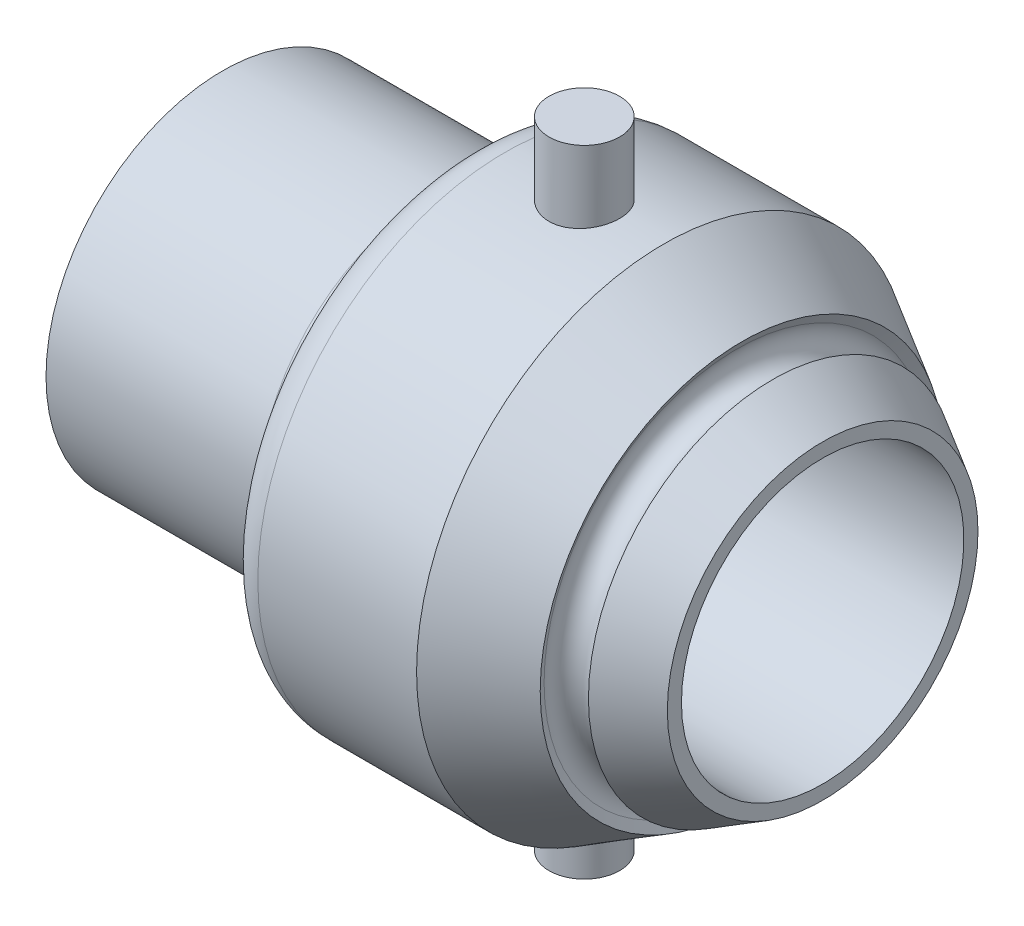
ISO-10303-21;
HEADER;
FILE_DESCRIPTION(('STEP AP214'),'2;1');
FILE_NAME('part.step','',(''),(''),'','','');
FILE_SCHEMA(('AUTOMOTIVE_DESIGN { 1 0 10303 214 1 1 1 1 }'));
ENDSEC;
DATA;
#1=APPLICATION_CONTEXT('core data for automotive mechanical design processes');
#2=APPLICATION_PROTOCOL_DEFINITION('international standard','automotive_design',2000,#1);
#3=PRODUCT_CONTEXT('',#1,'mechanical');
#4=PRODUCT('Part','Part','',(#3));
#5=PRODUCT_RELATED_PRODUCT_CATEGORY('part','',(#4));
#6=PRODUCT_DEFINITION_FORMATION('','',#4);
#7=PRODUCT_DEFINITION_CONTEXT('part definition',#1,'design');
#8=PRODUCT_DEFINITION('design','',#6,#7);
#9=PRODUCT_DEFINITION_SHAPE('','',#8);
#10=(LENGTH_UNIT() NAMED_UNIT(*) SI_UNIT(.MILLI.,.METRE.));
#11=(NAMED_UNIT(*) PLANE_ANGLE_UNIT() SI_UNIT($,.RADIAN.));
#12=(NAMED_UNIT(*) SI_UNIT($,.STERADIAN.) SOLID_ANGLE_UNIT());
#13=UNCERTAINTY_MEASURE_WITH_UNIT(LENGTH_MEASURE(1.E-05),#10,'distance_accuracy_value','');
#14=(GEOMETRIC_REPRESENTATION_CONTEXT(3) GLOBAL_UNCERTAINTY_ASSIGNED_CONTEXT((#13)) GLOBAL_UNIT_ASSIGNED_CONTEXT((#10,
#11,#12)) REPRESENTATION_CONTEXT('',''));
#15=CARTESIAN_POINT('',(0.,0.,0.));
#16=DIRECTION('',(0.,0.,1.));
#17=DIRECTION('',(1.,0.,0.));
#18=AXIS2_PLACEMENT_3D('',#15,#16,#17);
#19=CARTESIAN_POINT('',(-10.8230914252263,0.,0.));
#20=DIRECTION('',(-1.,0.,0.));
#21=DIRECTION('',(0.,0.,1.));
#22=AXIS2_PLACEMENT_3D('',#19,#20,#21);
#23=CYLINDRICAL_SURFACE('',#22,35.);
#24=CARTESIAN_POINT('',(-22.0596940616715,-34.6410161513775,-5.));
#25=CARTESIAN_POINT('',(-22.1993978457369,-34.6410154391642,-5.00000181224709));
#26=CARTESIAN_POINT('',(-22.339075896066,-34.6418629518526,-4.99414286579145));
#27=CARTESIAN_POINT('',(-22.617474900929,-34.6452270530683,-4.97075345355146));
#28=CARTESIAN_POINT('',(-22.7561956426971,-34.6477440012829,-4.95322047254227));
#29=CARTESIAN_POINT('',(-23.0317378663237,-34.6543774935575,-4.90659475442792));
#30=CARTESIAN_POINT('',(-23.1685579472749,-34.658495158733,-4.87749391506493));
#31=CARTESIAN_POINT('',(-23.439281311232,-34.6682124585494,-4.80793901020266));
#32=CARTESIAN_POINT('',(-23.5731835052484,-34.6738126365657,-4.76748078162647));
#33=CARTESIAN_POINT('',(-23.8369260548415,-34.6863261144397,-4.67556705521207));
#34=CARTESIAN_POINT('',(-23.9667707815617,-34.693237940152,-4.62412389515699));
#35=CARTESIAN_POINT('',(-24.2216972689336,-34.7081843179821,-4.51056759110166));
#36=CARTESIAN_POINT('',(-24.3467772539681,-34.7162192835375,-4.448450516));
#37=CARTESIAN_POINT('',(-24.591194657428,-34.733177760152,-4.31404058429293));
#38=CARTESIAN_POINT('',(-24.7105350631721,-34.7421008013996,-4.24175309977212));
#39=CARTESIAN_POINT('',(-24.942768913847,-34.7605914102924,-4.08745906749015));
#40=CARTESIAN_POINT('',(-25.055659944645,-34.7701592164031,-4.00544891520445));
#41=CARTESIAN_POINT('',(-25.2748472600182,-34.7897286484028,-3.83177001037932));
#42=CARTESIAN_POINT('',(-25.3810988300951,-34.7997325759272,-3.74004508176632));
#43=CARTESIAN_POINT('',(-25.5855502906051,-34.8198407002969,-3.54795991527328));
#44=CARTESIAN_POINT('',(-25.6837471872814,-34.8299449328735,-3.44759649479162));
#45=CARTESIAN_POINT('',(-25.8713346635188,-34.8499627971442,-3.23899148365546));
#46=CARTESIAN_POINT('',(-25.9607279976345,-34.8598764876709,-3.13075237578169));
#47=CARTESIAN_POINT('',(-26.1301493104485,-34.8792419453894,-2.90707506299795));
#48=CARTESIAN_POINT('',(-26.2101738232177,-34.8886935408841,-2.79163421791335));
#49=CARTESIAN_POINT('',(-26.3605522739934,-34.9069016885813,-2.55391409389059));
#50=CARTESIAN_POINT('',(-26.4308663522203,-34.9156553170766,-2.43160936732319));
#51=CARTESIAN_POINT('',(-26.5609590565678,-34.9321803214305,-2.18140012986931));
#52=CARTESIAN_POINT('',(-26.620733757101,-34.9399513309909,-2.05349355452121));
#53=CARTESIAN_POINT('',(-26.729253576418,-34.9542827788644,-1.79306831729175));
#54=CARTESIAN_POINT('',(-26.7780031823983,-34.9608437094765,-1.66055155717825));
#55=CARTESIAN_POINT('',(-26.8641534620071,-34.9725754856837,-1.39180486373783));
#56=CARTESIAN_POINT('',(-26.9015499761033,-34.9777458217154,-1.25557358936556));
#57=CARTESIAN_POINT('',(-26.9957634739704,-34.9908661236587,-0.844743976273192));
#58=CARTESIAN_POINT('',(-27.0354698769677,-34.9965435452706,-0.565925356335789));
#59=CARTESIAN_POINT('',(-27.0675681669798,-35.0011225996405,-0.00568137169031785));
#60=CARTESIAN_POINT('',(-27.0599624510189,-35.0000245756701,0.275743860234863));
#61=CARTESIAN_POINT('',(-26.9979668096282,-34.9912220174932,0.831236202825564));
#62=CARTESIAN_POINT('',(-26.9439180443854,-34.983565660607,1.1053419772077));
#63=CARTESIAN_POINT('',(-26.7910886825275,-34.9625573280242,1.64054201011344));
#64=CARTESIAN_POINT('',(-26.6923070229818,-34.9492052169872,1.90163595929008));
#65=CARTESIAN_POINT('',(-26.4524669249869,-34.918223457376,2.40445410298172));
#66=CARTESIAN_POINT('',(-26.311263610238,-34.9005791903821,2.64610826381352));
#67=CARTESIAN_POINT('',(-25.9906929034616,-34.8629816813172,3.10241976852131));
#68=CARTESIAN_POINT('',(-25.8113232298769,-34.8430283012416,3.31707549722948));
#69=CARTESIAN_POINT('',(-25.4176075374912,-34.8028301198188,3.715307418436));
#70=CARTESIAN_POINT('',(-25.2029637244415,-34.7825843067691,3.89858921744104));
#71=CARTESIAN_POINT('',(-24.7458077634548,-34.7442573479033,4.22657475561672));
#72=CARTESIAN_POINT('',(-24.5032954727453,-34.7261762131781,4.37127829713491));
#73=CARTESIAN_POINT('',(-23.9969933354672,-34.6942263418025,4.61803253378663));
#74=CARTESIAN_POINT('',(-23.7331895465721,-34.6803603941768,4.7200550052405));
#75=CARTESIAN_POINT('',(-23.1919501124996,-34.6584616452935,4.8782655937619));
#76=CARTESIAN_POINT('',(-22.9145153358253,-34.6504284729119,4.93445662699028));
#77=CARTESIAN_POINT('',(-22.3565027179648,-34.6411745189243,4.99900976722198));
#78=CARTESIAN_POINT('',(-22.0759739965445,-34.6398944301118,5.00778827871545));
#79=CARTESIAN_POINT('',(-21.5174495492465,-34.6441343132837,4.97837020507439));
#80=CARTESIAN_POINT('',(-21.2394537525335,-34.6496540945125,4.94017493768696));
#81=CARTESIAN_POINT('',(-20.695163611182,-34.6668174132737,4.81824595075754));
#82=CARTESIAN_POINT('',(-20.428822242475,-34.6784332841747,4.73471791248743));
#83=CARTESIAN_POINT('',(-19.9139220695634,-34.7064572797608,4.52470763790893));
#84=CARTESIAN_POINT('',(-19.6653640684815,-34.7228656207111,4.39822346311933));
#85=CARTESIAN_POINT('',(-19.1912143566143,-34.7587662123785,4.10488406983362));
#86=CARTESIAN_POINT('',(-18.965791637102,-34.778278818957,3.93775823113058));
#87=CARTESIAN_POINT('',(-18.5460447741473,-34.8181272639984,3.56825671506987));
#88=CARTESIAN_POINT('',(-18.3517222219303,-34.838463144517,3.36587923518415));
#89=CARTESIAN_POINT('',(-17.9982059345754,-34.8778513391193,2.92979358250642));
#90=CARTESIAN_POINT('',(-17.8392874524726,-34.8968928467999,2.69586117657925));
#91=CARTESIAN_POINT('',(-17.5630054572246,-34.9313804312442,2.20436851574153));
#92=CARTESIAN_POINT('',(-17.4456408948735,-34.9468265987843,1.94680885760851));
#93=CARTESIAN_POINT('',(-17.2562376471943,-34.9723373469684,1.41630188802803));
#94=CARTESIAN_POINT('',(-17.1840458843711,-34.9824200851104,1.14340999758268));
#95=CARTESIAN_POINT('',(-17.0865595993857,-34.9961374843224,0.589068150525985));
#96=CARTESIAN_POINT('',(-17.061262279905,-34.9997725300055,0.30761870540268));
#97=CARTESIAN_POINT('',(-17.0590198666507,-35.0000980196249,-0.113202683468913));
#98=CARTESIAN_POINT('',(-17.064133141888,-34.9993649007347,-0.252701211609335));
#99=CARTESIAN_POINT('',(-17.0859921116903,-34.9962506918872,-0.53075131423225));
#100=CARTESIAN_POINT('',(-17.1027334595812,-34.9938702177269,-0.669303223032251));
#101=CARTESIAN_POINT('',(-17.1477362039289,-34.9875241065998,-0.944527140960395));
#102=CARTESIAN_POINT('',(-17.1760017491767,-34.983557898768,-1.08119845472438));
#103=CARTESIAN_POINT('',(-17.2438266940139,-34.9741540277206,-1.35160692511812));
#104=CARTESIAN_POINT('',(-17.2833820007001,-34.968716897799,-1.48534512620927));
#105=CARTESIAN_POINT('',(-17.3734881709636,-34.956523509257,-1.7489637666951));
#106=CARTESIAN_POINT('',(-17.4240362848606,-34.9497675805569,-1.87884516159298));
#107=CARTESIAN_POINT('',(-17.5357461086089,-34.9351261885931,-2.13383759136382));
#108=CARTESIAN_POINT('',(-17.5969039844728,-34.9272411335341,-2.25895032960641));
#109=CARTESIAN_POINT('',(-17.7294339304515,-34.9105547366064,-2.50364014566413));
#110=CARTESIAN_POINT('',(-17.8008098396667,-34.9017530506831,-2.62321512039114));
#111=CARTESIAN_POINT('',(-17.9532286285108,-34.8834823136215,-2.8559203177104));
#112=CARTESIAN_POINT('',(-18.0342680603716,-34.8740135009922,-2.96905281770033));
#113=CARTESIAN_POINT('',(-18.2062334109251,-34.8545807366046,-3.18912439994285));
#114=CARTESIAN_POINT('',(-18.2972407398476,-34.8446131343377,-3.29599955535524));
#115=CARTESIAN_POINT('',(-18.4878738408071,-34.8245448080178,-3.50167884270045));
#116=CARTESIAN_POINT('',(-18.5874964946601,-34.814444133241,-3.60048586980278));
#117=CARTESIAN_POINT('',(-18.7947614430297,-34.7943837777507,-3.789444905816));
#118=CARTESIAN_POINT('',(-18.9024085306275,-34.7844241856026,-3.87959166708625));
#119=CARTESIAN_POINT('',(-19.1248839932983,-34.7649369098833,-4.05050109467336));
#120=CARTESIAN_POINT('',(-19.2397097025496,-34.7554090682198,-4.13126721307556));
#121=CARTESIAN_POINT('',(-19.4764293305504,-34.7370013113202,-4.28329753184929));
#122=CARTESIAN_POINT('',(-19.5983583864441,-34.7281252136464,-4.35450750137419));
#123=CARTESIAN_POINT('',(-19.8478064857851,-34.7113377418939,-4.48636261684556));
#124=CARTESIAN_POINT('',(-19.9753234540685,-34.7034260137396,-4.54701164384715));
#125=CARTESIAN_POINT('',(-20.2349940640194,-34.6887985721337,-4.65728990592972));
#126=CARTESIAN_POINT('',(-20.3671441511383,-34.6820819648177,-4.70692738377103));
#127=CARTESIAN_POINT('',(-20.635181009048,-34.670034668512,-4.79485763175049));
#128=CARTESIAN_POINT('',(-20.7710669209639,-34.6647036638671,-4.8331529860243));
#129=CARTESIAN_POINT('',(-21.0967049713403,-34.6538884329244,-4.91020164286521));
#130=CARTESIAN_POINT('',(-21.2877135358684,-34.6490831060692,-4.94383927658103));
#131=CARTESIAN_POINT('',(-21.6723959179535,-34.642647476579,-4.98873707431739));
#132=CARTESIAN_POINT('',(-21.8660697057155,-34.6410171384792,-4.99999748829154));
#133=CARTESIAN_POINT('',(-22.0596940616715,-34.6410161513775,-5.));
#134=B_SPLINE_CURVE_WITH_KNOTS('',3,(#24,#25,#26,#27,#28,#29,#30,#31,#32,#33,#34,#35,#36,#37,
#38,#39,#40,#41,#42,#43,#44,#45,#46,#47,#48,#49,#50,#51,#52,#53,#54,#55,#56,#57,#58,#59,#60,#61,
#62,#63,#64,#65,#66,#67,#68,#69,#70,#71,#72,#73,#74,#75,#76,#77,#78,#79,#80,#81,#82,#83,#84,#85,
#86,#87,#88,#89,#90,#91,#92,#93,#94,#95,#96,#97,#98,#99,#100,#101,#102,#103,#104,#105,#106,#107,
#108,#109,#110,#111,#112,#113,#114,#115,#116,#117,#118,#119,#120,#121,#122,#123,#124,#125,#126,
#127,#128,#129,#130,#131,#132,#133),.UNSPECIFIED.,.T.,.F.,(4,2,2,2,2,2,2,2,2,2,2,2,2,2,2,2,2,2,
2,2,2,2,2,2,2,2,2,2,2,2,2,2,2,2,2,2,2,2,2,2,2,2,2,2,2,2,2,2,2,2,2,2,2,2,4),(0.,
0.418941757697899,0.837973807559078,1.25729987077408,1.67677984006801,2.09579112334161,
2.51495705653461,2.93390240869217,3.35300356675528,3.77467626293622,4.1965049826565,
4.61820129384828,5.04005311891656,5.46358814046364,5.88728058379115,6.31080027336864,
6.73447494484351,7.57513090903345,8.41574428252049,9.25023497825405,10.0847455039608,
10.9221390466027,11.759582662094,12.6044983052241,13.449418277125,14.2948960888448,
15.1403201003399,15.978306882632,16.8162701575656,17.6504628756755,18.4846932433961,
19.3246383808546,20.164626479983,21.0109333936222,21.8572189371095,22.7006209090407,
23.5439725692556,23.9623475710554,24.3805662647757,24.7989356532617,25.2171535615622,
25.6352669792153,26.0532296192162,26.4713497095274,26.8893210660889,27.3110044309822,
27.7325358077672,28.1543210190645,28.5759505178875,28.9998797832738,29.4236529280186,
29.8471077763731,30.2704660724344,30.8511105743425,31.4317485904134),.UNSPECIFIED.);
#135=CARTESIAN_POINT('',(-22.0596940616715,-34.6410161513775,-5.));
#136=VERTEX_POINT('',#135);
#137=EDGE_CURVE('E72',#136,#136,#134,.T.);
#138=ORIENTED_EDGE('',*,*,#137,.T.);
#139=EDGE_LOOP('',(#138));
#140=FACE_BOUND('',#139,.T.);
#141=CARTESIAN_POINT('',(-33.3013638124738,0.,0.));
#142=DIRECTION('',(1.,0.,0.));
#143=DIRECTION('',(0.,0.,-1.));
#144=AXIS2_PLACEMENT_3D('',#141,#142,#143);
#145=CIRCLE('',#144,35.);
#146=CARTESIAN_POINT('',(-33.3013638124738,0.,-35.));
#147=VERTEX_POINT('',#146);
#148=EDGE_CURVE('E45',#147,#147,#145,.T.);
#149=ORIENTED_EDGE('',*,*,#148,.T.);
#150=EDGE_LOOP('',(#149));
#151=FACE_BOUND('',#150,.T.);
#152=CARTESIAN_POINT('',(-10.8180243108691,0.,0.));
#153=DIRECTION('',(-1.,0.,0.));
#154=DIRECTION('',(0.,0.,1.));
#155=AXIS2_PLACEMENT_3D('',#152,#153,#154);
#156=CIRCLE('',#155,35.);
#157=CARTESIAN_POINT('',(-10.8180243108691,0.,35.));
#158=VERTEX_POINT('',#157);
#159=EDGE_CURVE('E78',#158,#158,#156,.T.);
#160=ORIENTED_EDGE('',*,*,#159,.T.);
#161=EDGE_LOOP('',(#160));
#162=FACE_BOUND('',#161,.T.);
#163=CARTESIAN_POINT('',(-22.0596940616715,34.6410161513775,-5.));
#164=CARTESIAN_POINT('',(-22.1993978457369,34.6410154391642,-5.00000181224709));
#165=CARTESIAN_POINT('',(-22.339075896066,34.6418629518526,-4.99414286579145));
#166=CARTESIAN_POINT('',(-22.617474900929,34.6452270530683,-4.97075345355146));
#167=CARTESIAN_POINT('',(-22.7561956426971,34.6477440012829,-4.95322047254227));
#168=CARTESIAN_POINT('',(-23.0317378663237,34.6543774935575,-4.90659475442792));
#169=CARTESIAN_POINT('',(-23.1685579472749,34.658495158733,-4.87749391506493));
#170=CARTESIAN_POINT('',(-23.439281311232,34.6682124585494,-4.80793901020266));
#171=CARTESIAN_POINT('',(-23.5731835052484,34.6738126365657,-4.76748078162647));
#172=CARTESIAN_POINT('',(-23.8369260548415,34.6863261144397,-4.67556705521207));
#173=CARTESIAN_POINT('',(-23.9667707815617,34.693237940152,-4.62412389515699));
#174=CARTESIAN_POINT('',(-24.2216972689336,34.7081843179821,-4.51056759110166));
#175=CARTESIAN_POINT('',(-24.3467772539681,34.7162192835375,-4.448450516));
#176=CARTESIAN_POINT('',(-24.591194657428,34.733177760152,-4.31404058429293));
#177=CARTESIAN_POINT('',(-24.7105350631721,34.7421008013996,-4.24175309977212));
#178=CARTESIAN_POINT('',(-24.942768913847,34.7605914102924,-4.08745906749015));
#179=CARTESIAN_POINT('',(-25.055659944645,34.7701592164031,-4.00544891520445));
#180=CARTESIAN_POINT('',(-25.2748472600182,34.7897286484028,-3.83177001037932));
#181=CARTESIAN_POINT('',(-25.3810988300951,34.7997325759272,-3.74004508176632));
#182=CARTESIAN_POINT('',(-25.5855502906051,34.8198407002969,-3.54795991527328));
#183=CARTESIAN_POINT('',(-25.6837471872814,34.8299449328735,-3.44759649479162));
#184=CARTESIAN_POINT('',(-25.8713346635188,34.8499627971442,-3.23899148365546));
#185=CARTESIAN_POINT('',(-25.9607279976345,34.8598764876709,-3.13075237578169));
#186=CARTESIAN_POINT('',(-26.1301493104485,34.8792419453894,-2.90707506299795));
#187=CARTESIAN_POINT('',(-26.2101738232177,34.8886935408841,-2.79163421791335));
#188=CARTESIAN_POINT('',(-26.3605522739934,34.9069016885813,-2.55391409389059));
#189=CARTESIAN_POINT('',(-26.4308663522203,34.9156553170766,-2.43160936732319));
#190=CARTESIAN_POINT('',(-26.5609590565678,34.9321803214305,-2.18140012986931));
#191=CARTESIAN_POINT('',(-26.620733757101,34.9399513309909,-2.05349355452121));
#192=CARTESIAN_POINT('',(-26.729253576418,34.9542827788644,-1.79306831729175));
#193=CARTESIAN_POINT('',(-26.7780031823983,34.9608437094765,-1.66055155717825));
#194=CARTESIAN_POINT('',(-26.8641534620071,34.9725754856837,-1.39180486373783));
#195=CARTESIAN_POINT('',(-26.9015499761033,34.9777458217154,-1.25557358936556));
#196=CARTESIAN_POINT('',(-26.9957634739704,34.9908661236587,-0.844743976273192));
#197=CARTESIAN_POINT('',(-27.0354698769677,34.9965435452706,-0.565925356335789));
#198=CARTESIAN_POINT('',(-27.0675681669798,35.0011225996405,-0.00568137169031785));
#199=CARTESIAN_POINT('',(-27.0599624510189,35.0000245756701,0.275743860234863));
#200=CARTESIAN_POINT('',(-26.9979668096282,34.9912220174932,0.831236202825564));
#201=CARTESIAN_POINT('',(-26.9439180443854,34.983565660607,1.1053419772077));
#202=CARTESIAN_POINT('',(-26.7910886825275,34.9625573280242,1.64054201011344));
#203=CARTESIAN_POINT('',(-26.6923070229818,34.9492052169872,1.90163595929008));
#204=CARTESIAN_POINT('',(-26.4524669249869,34.918223457376,2.40445410298172));
#205=CARTESIAN_POINT('',(-26.311263610238,34.9005791903821,2.64610826381352));
#206=CARTESIAN_POINT('',(-25.9906929034616,34.8629816813172,3.10241976852131));
#207=CARTESIAN_POINT('',(-25.8113232298769,34.8430283012416,3.31707549722948));
#208=CARTESIAN_POINT('',(-25.4176075374912,34.8028301198188,3.715307418436));
#209=CARTESIAN_POINT('',(-25.2029637244415,34.7825843067691,3.89858921744104));
#210=CARTESIAN_POINT('',(-24.7458077634548,34.7442573479033,4.22657475561672));
#211=CARTESIAN_POINT('',(-24.5032954727453,34.7261762131781,4.37127829713491));
#212=CARTESIAN_POINT('',(-23.9969933354672,34.6942263418025,4.61803253378663));
#213=CARTESIAN_POINT('',(-23.7331895465721,34.6803603941768,4.7200550052405));
#214=CARTESIAN_POINT('',(-23.1919501124996,34.6584616452935,4.8782655937619));
#215=CARTESIAN_POINT('',(-22.9145153358253,34.6504284729119,4.93445662699028));
#216=CARTESIAN_POINT('',(-22.3565027179648,34.6411745189243,4.99900976722198));
#217=CARTESIAN_POINT('',(-22.0759739965445,34.6398944301118,5.00778827871545));
#218=CARTESIAN_POINT('',(-21.5174495492465,34.6441343132837,4.97837020507439));
#219=CARTESIAN_POINT('',(-21.2394537525335,34.6496540945125,4.94017493768696));
#220=CARTESIAN_POINT('',(-20.695163611182,34.6668174132737,4.81824595075754));
#221=CARTESIAN_POINT('',(-20.428822242475,34.6784332841747,4.73471791248743));
#222=CARTESIAN_POINT('',(-19.9139220695634,34.7064572797608,4.52470763790893));
#223=CARTESIAN_POINT('',(-19.6653640684815,34.7228656207111,4.39822346311933));
#224=CARTESIAN_POINT('',(-19.1912143566143,34.7587662123785,4.10488406983362));
#225=CARTESIAN_POINT('',(-18.965791637102,34.778278818957,3.93775823113058));
#226=CARTESIAN_POINT('',(-18.5460447741473,34.8181272639984,3.56825671506987));
#227=CARTESIAN_POINT('',(-18.3517222219303,34.838463144517,3.36587923518415));
#228=CARTESIAN_POINT('',(-17.9982059345754,34.8778513391193,2.92979358250642));
#229=CARTESIAN_POINT('',(-17.8392874524726,34.8968928467999,2.69586117657925));
#230=CARTESIAN_POINT('',(-17.5630054572246,34.9313804312442,2.20436851574153));
#231=CARTESIAN_POINT('',(-17.4456408948735,34.9468265987843,1.94680885760851));
#232=CARTESIAN_POINT('',(-17.2562376471943,34.9723373469684,1.41630188802803));
#233=CARTESIAN_POINT('',(-17.1840458843711,34.9824200851104,1.14340999758268));
#234=CARTESIAN_POINT('',(-17.0865595993857,34.9961374843224,0.589068150525985));
#235=CARTESIAN_POINT('',(-17.061262279905,34.9997725300055,0.30761870540268));
#236=CARTESIAN_POINT('',(-17.0590198666507,35.0000980196249,-0.113202683468913));
#237=CARTESIAN_POINT('',(-17.064133141888,34.9993649007347,-0.252701211609335));
#238=CARTESIAN_POINT('',(-17.0859921116903,34.9962506918872,-0.53075131423225));
#239=CARTESIAN_POINT('',(-17.1027334595812,34.9938702177269,-0.669303223032251));
#240=CARTESIAN_POINT('',(-17.1477362039289,34.9875241065998,-0.944527140960395));
#241=CARTESIAN_POINT('',(-17.1760017491767,34.983557898768,-1.08119845472438));
#242=CARTESIAN_POINT('',(-17.2438266940139,34.9741540277206,-1.35160692511812));
#243=CARTESIAN_POINT('',(-17.2833820007001,34.968716897799,-1.48534512620927));
#244=CARTESIAN_POINT('',(-17.3734881709636,34.956523509257,-1.7489637666951));
#245=CARTESIAN_POINT('',(-17.4240362848606,34.9497675805569,-1.87884516159298));
#246=CARTESIAN_POINT('',(-17.5357461086089,34.9351261885931,-2.13383759136382));
#247=CARTESIAN_POINT('',(-17.5969039844728,34.9272411335341,-2.25895032960641));
#248=CARTESIAN_POINT('',(-17.7294339304515,34.9105547366064,-2.50364014566413));
#249=CARTESIAN_POINT('',(-17.8008098396667,34.9017530506831,-2.62321512039114));
#250=CARTESIAN_POINT('',(-17.9532286285108,34.8834823136215,-2.8559203177104));
#251=CARTESIAN_POINT('',(-18.0342680603716,34.8740135009922,-2.96905281770033));
#252=CARTESIAN_POINT('',(-18.2062334109251,34.8545807366046,-3.18912439994285));
#253=CARTESIAN_POINT('',(-18.2972407398476,34.8446131343377,-3.29599955535524));
#254=CARTESIAN_POINT('',(-18.4878738408071,34.8245448080178,-3.50167884270045));
#255=CARTESIAN_POINT('',(-18.5874964946601,34.814444133241,-3.60048586980278));
#256=CARTESIAN_POINT('',(-18.7947614430297,34.7943837777507,-3.789444905816));
#257=CARTESIAN_POINT('',(-18.9024085306275,34.7844241856026,-3.87959166708625));
#258=CARTESIAN_POINT('',(-19.1248839932983,34.7649369098833,-4.05050109467336));
#259=CARTESIAN_POINT('',(-19.2397097025496,34.7554090682198,-4.13126721307556));
#260=CARTESIAN_POINT('',(-19.4764293305504,34.7370013113202,-4.28329753184929));
#261=CARTESIAN_POINT('',(-19.5983583864441,34.7281252136464,-4.35450750137419));
#262=CARTESIAN_POINT('',(-19.8478064857851,34.7113377418939,-4.48636261684556));
#263=CARTESIAN_POINT('',(-19.9753234540685,34.7034260137396,-4.54701164384715));
#264=CARTESIAN_POINT('',(-20.2349940640194,34.6887985721337,-4.65728990592972));
#265=CARTESIAN_POINT('',(-20.3671441511383,34.6820819648177,-4.70692738377103));
#266=CARTESIAN_POINT('',(-20.635181009048,34.670034668512,-4.79485763175049));
#267=CARTESIAN_POINT('',(-20.7710669209639,34.6647036638671,-4.8331529860243));
#268=CARTESIAN_POINT('',(-21.0967049713403,34.6538884329244,-4.91020164286521));
#269=CARTESIAN_POINT('',(-21.2877135358684,34.6490831060692,-4.94383927658103));
#270=CARTESIAN_POINT('',(-21.6723959179535,34.642647476579,-4.98873707431739));
#271=CARTESIAN_POINT('',(-21.8660697057155,34.6410171384792,-4.99999748829154));
#272=CARTESIAN_POINT('',(-22.0596940616715,34.6410161513775,-5.));
#273=B_SPLINE_CURVE_WITH_KNOTS('',3,(#163,#164,#165,#166,#167,#168,#169,#170,#171,#172,#173,
#174,#175,#176,#177,#178,#179,#180,#181,#182,#183,#184,#185,#186,#187,#188,#189,#190,#191,#192,
#193,#194,#195,#196,#197,#198,#199,#200,#201,#202,#203,#204,#205,#206,#207,#208,#209,#210,#211,
#212,#213,#214,#215,#216,#217,#218,#219,#220,#221,#222,#223,#224,#225,#226,#227,#228,#229,#230,
#231,#232,#233,#234,#235,#236,#237,#238,#239,#240,#241,#242,#243,#244,#245,#246,#247,#248,#249,
#250,#251,#252,#253,#254,#255,#256,#257,#258,#259,#260,#261,#262,#263,#264,#265,#266,#267,#268,
#269,#270,#271,#272),.UNSPECIFIED.,.T.,.F.,(4,2,2,2,2,2,2,2,2,2,2,2,2,2,2,2,2,2,2,2,2,2,2,2,2,2,
2,2,2,2,2,2,2,2,2,2,2,2,2,2,2,2,2,2,2,2,2,2,2,2,2,2,2,2,4),(0.,0.418941757697899,
0.837973807559078,1.25729987077408,1.67677984006801,2.09579112334161,2.51495705653461,
2.93390240869217,3.35300356675528,3.77467626293622,4.1965049826565,4.61820129384828,
5.04005311891656,5.46358814046364,5.88728058379115,6.31080027336864,6.73447494484351,
7.57513090903345,8.41574428252049,9.25023497825405,10.0847455039608,10.9221390466027,
11.759582662094,12.6044983052241,13.449418277125,14.2948960888448,15.1403201003399,
15.978306882632,16.8162701575656,17.6504628756755,18.4846932433961,19.3246383808546,
20.164626479983,21.0109333936222,21.8572189371095,22.7006209090407,23.5439725692556,
23.9623475710554,24.3805662647757,24.7989356532617,25.2171535615622,25.6352669792153,
26.0532296192162,26.4713497095274,26.8893210660889,27.3110044309822,27.7325358077672,
28.1543210190645,28.5759505178875,28.9998797832738,29.4236529280186,29.8471077763731,
30.2704660724344,30.8511105743425,31.4317485904134),.UNSPECIFIED.);
#274=CARTESIAN_POINT('',(-22.0596940616715,34.6410161513775,-5.));
#275=VERTEX_POINT('',#274);
#276=EDGE_CURVE('E10',#275,#275,#273,.T.);
#277=ORIENTED_EDGE('',*,*,#276,.F.);
#278=EDGE_LOOP('',(#277));
#279=FACE_BOUND('',#278,.T.);
#280=ADVANCED_FACE('F33',(#140,#151,#162,#279),#23,.T.);
#281=CARTESIAN_POINT('',(-10.8230914252263,0.,0.));
#282=DIRECTION('',(-1.,0.,0.));
#283=DIRECTION('',(0.,0.,1.));
#284=AXIS2_PLACEMENT_3D('',#281,#282,#283);
#285=CYLINDRICAL_SURFACE('',#284,20.);
#286=CARTESIAN_POINT('',(11.6986361875262,0.,0.));
#287=DIRECTION('',(-1.,0.,0.));
#288=DIRECTION('',(0.,0.,1.));
#289=AXIS2_PLACEMENT_3D('',#286,#287,#288);
#290=CIRCLE('',#289,20.);
#291=CARTESIAN_POINT('',(11.6986361875262,0.,20.));
#292=VERTEX_POINT('',#291);
#293=EDGE_CURVE('E54',#292,#292,#290,.T.);
#294=ORIENTED_EDGE('',*,*,#293,.F.);
#295=EDGE_LOOP('',(#294));
#296=FACE_BOUND('',#295,.T.);
#297=CARTESIAN_POINT('',(-73.3013638124738,0.,0.));
#298=DIRECTION('',(-1.,0.,0.));
#299=DIRECTION('',(0.,0.,1.));
#300=AXIS2_PLACEMENT_3D('',#297,#298,#299);
#301=CIRCLE('',#300,20.);
#302=CARTESIAN_POINT('',(-73.3013638124738,0.,20.));
#303=VERTEX_POINT('',#302);
#304=EDGE_CURVE('E59',#303,#303,#301,.T.);
#305=ORIENTED_EDGE('',*,*,#304,.T.);
#306=EDGE_LOOP('',(#305));
#307=FACE_BOUND('',#306,.T.);
#308=ADVANCED_FACE('F100',(#296,#307),#285,.F.);
#309=CARTESIAN_POINT('',(11.6986361875262,22.,0.));
#310=DIRECTION('',(-1.,0.,0.));
#311=DIRECTION('',(0.,0.,1.));
#312=AXIS2_PLACEMENT_3D('',#309,#310,#311);
#313=PLANE('',#312);
#314=CARTESIAN_POINT('',(11.6986361875262,0.,0.));
#315=DIRECTION('',(-1.,0.,0.));
#316=DIRECTION('',(0.,0.,1.));
#317=AXIS2_PLACEMENT_3D('',#314,#315,#316);
#318=CIRCLE('',#317,22.);
#319=CARTESIAN_POINT('',(11.6986361875262,0.,22.));
#320=VERTEX_POINT('',#319);
#321=EDGE_CURVE('E93',#320,#320,#318,.T.);
#322=ORIENTED_EDGE('',*,*,#321,.F.);
#323=EDGE_LOOP('',(#322));
#324=FACE_BOUND('',#323,.T.);
#325=ORIENTED_EDGE('',*,*,#293,.T.);
#326=EDGE_LOOP('',(#325));
#327=FACE_BOUND('',#326,.T.);
#328=ADVANCED_FACE('F98',(#324,#327),#313,.F.);
#329=CARTESIAN_POINT('',(11.6986361875262,0.,0.));
#330=DIRECTION('',(-1.,0.,0.));
#331=DIRECTION('',(0.,0.,1.));
#332=AXIS2_PLACEMENT_3D('',#329,#330,#331);
#333=CONICAL_SURFACE('',#332,22.,0.5235987755983);
#334=CARTESIAN_POINT('',(4.61369969698731,0.,0.));
#335=DIRECTION('',(-1.,0.,0.));
#336=DIRECTION('',(0.,0.,1.));
#337=AXIS2_PLACEMENT_3D('',#334,#335,#336);
#338=CIRCLE('',#337,26.0904899900041);
#339=CARTESIAN_POINT('',(4.61369969698731,0.,26.0904899900041));
#340=VERTEX_POINT('',#339);
#341=EDGE_CURVE('E90',#340,#340,#338,.T.);
#342=ORIENTED_EDGE('',*,*,#341,.F.);
#343=EDGE_LOOP('',(#342));
#344=FACE_BOUND('',#343,.T.);
#345=ORIENTED_EDGE('',*,*,#321,.T.);
#346=EDGE_LOOP('',(#345));
#347=FACE_BOUND('',#346,.T.);
#348=ADVANCED_FACE('F138',(#344,#347),#333,.T.);
#349=CARTESIAN_POINT('',(4.61369969698731,0.,0.));
#350=DIRECTION('',(1.,0.,0.));
#351=DIRECTION('',(0.,0.,-1.));
#352=AXIS2_PLACEMENT_3D('',#349,#350,#351);
#353=CONICAL_SURFACE('',#352,26.0904899900041,1.0471975511966);
#354=CARTESIAN_POINT('',(3.8636996969873,0.,0.));
#355=DIRECTION('',(-1.,0.,0.));
#356=DIRECTION('',(0.,0.,1.));
#357=AXIS2_PLACEMENT_3D('',#354,#355,#356);
#358=CIRCLE('',#357,24.7914518843274);
#359=CARTESIAN_POINT('',(3.8636996969873,0.,24.7914518843274));
#360=VERTEX_POINT('',#359);
#361=EDGE_CURVE('E87',#360,#360,#358,.T.);
#362=ORIENTED_EDGE('',*,*,#361,.F.);
#363=EDGE_LOOP('',(#362));
#364=FACE_BOUND('',#363,.T.);
#365=ORIENTED_EDGE('',*,*,#341,.T.);
#366=EDGE_LOOP('',(#365));
#367=FACE_BOUND('',#366,.T.);
#368=ADVANCED_FACE('F134',(#364,#367),#353,.T.);
#369=CARTESIAN_POINT('',(1.69863618752621,0.,0.));
#370=DIRECTION('',(-1.,0.,0.));
#371=DIRECTION('',(0.,0.,1.));
#372=AXIS2_PLACEMENT_3D('',#369,#370,#371);
#373=TOROIDAL_SURFACE('',#372,26.0414518843274,2.5);
#374=CARTESIAN_POINT('',(-0.466427321934889,0.,0.));
#375=DIRECTION('',(-1.,0.,0.));
#376=DIRECTION('',(0.,0.,1.));
#377=AXIS2_PLACEMENT_3D('',#374,#375,#376);
#378=CIRCLE('',#377,27.2914518843274);
#379=CARTESIAN_POINT('',(-0.466427321934889,0.,27.2914518843274));
#380=VERTEX_POINT('',#379);
#381=EDGE_CURVE('E84',#380,#380,#378,.T.);
#382=ORIENTED_EDGE('',*,*,#381,.F.);
#383=EDGE_LOOP('',(#382));
#384=FACE_BOUND('',#383,.T.);
#385=ORIENTED_EDGE('',*,*,#361,.T.);
#386=EDGE_LOOP('',(#385));
#387=FACE_BOUND('',#386,.T.);
#388=ADVANCED_FACE('F130',(#384,#387),#373,.F.);
#389=CARTESIAN_POINT('',(-0.466427321934889,0.,0.));
#390=DIRECTION('',(1.,0.,0.));
#391=DIRECTION('',(0.,0.,-1.));
#392=AXIS2_PLACEMENT_3D('',#389,#390,#391);
#393=CONICAL_SURFACE('',#392,27.2914518843274,1.0471975511966);
#394=CARTESIAN_POINT('',(0.283572678065114,0.,0.));
#395=DIRECTION('',(-1.,0.,0.));
#396=DIRECTION('',(0.,0.,1.));
#397=AXIS2_PLACEMENT_3D('',#394,#395,#396);
#398=CIRCLE('',#397,28.5904899900041);
#399=CARTESIAN_POINT('',(0.283572678065114,0.,28.5904899900041));
#400=VERTEX_POINT('',#399);
#401=EDGE_CURVE('E81',#400,#400,#398,.T.);
#402=ORIENTED_EDGE('',*,*,#401,.F.);
#403=EDGE_LOOP('',(#402));
#404=FACE_BOUND('',#403,.T.);
#405=ORIENTED_EDGE('',*,*,#381,.T.);
#406=EDGE_LOOP('',(#405));
#407=FACE_BOUND('',#406,.T.);
#408=ADVANCED_FACE('F118',(#404,#407),#393,.F.);
#409=CARTESIAN_POINT('',(0.283572678065114,0.,0.));
#410=DIRECTION('',(-1.,0.,0.));
#411=DIRECTION('',(0.,0.,1.));
#412=AXIS2_PLACEMENT_3D('',#409,#410,#411);
#413=CONICAL_SURFACE('',#412,28.5904899900041,0.5235987755983);
#414=ORIENTED_EDGE('',*,*,#159,.F.);
#415=EDGE_LOOP('',(#414));
#416=FACE_BOUND('',#415,.T.);
#417=ORIENTED_EDGE('',*,*,#401,.T.);
#418=EDGE_LOOP('',(#417));
#419=FACE_BOUND('',#418,.T.);
#420=ADVANCED_FACE('F109',(#416,#419),#413,.T.);
#421=CARTESIAN_POINT('',(-73.3013638124738,0.,0.));
#422=DIRECTION('',(-1.,0.,0.));
#423=DIRECTION('',(0.,0.,1.));
#424=AXIS2_PLACEMENT_3D('',#421,#422,#423);
#425=PLANE('',#424);
#426=CARTESIAN_POINT('',(-73.3013638124738,0.,0.));
#427=DIRECTION('',(-1.,0.,0.));
#428=DIRECTION('',(0.,0.,1.));
#429=AXIS2_PLACEMENT_3D('',#426,#427,#428);
#430=CIRCLE('',#429,25.);
#431=CARTESIAN_POINT('',(-73.3013638124738,0.,25.));
#432=VERTEX_POINT('',#431);
#433=EDGE_CURVE('E64',#432,#432,#430,.T.);
#434=ORIENTED_EDGE('',*,*,#433,.T.);
#435=EDGE_LOOP('',(#434));
#436=FACE_BOUND('',#435,.T.);
#437=ORIENTED_EDGE('',*,*,#304,.F.);
#438=EDGE_LOOP('',(#437));
#439=FACE_BOUND('',#438,.T.);
#440=ADVANCED_FACE('F106',(#436,#439),#425,.T.);
#441=CARTESIAN_POINT('',(-73.3013638124738,0.,0.));
#442=DIRECTION('',(1.,0.,0.));
#443=DIRECTION('',(0.,0.,-1.));
#444=AXIS2_PLACEMENT_3D('',#441,#442,#443);
#445=CYLINDRICAL_SURFACE('',#444,25.);
#446=CARTESIAN_POINT('',(-43.3013638124738,0.,0.));
#447=DIRECTION('',(1.,0.,0.));
#448=DIRECTION('',(0.,0.,-1.));
#449=AXIS2_PLACEMENT_3D('',#446,#447,#448);
#450=CIRCLE('',#449,25.);
#451=CARTESIAN_POINT('',(-43.3013638124738,0.,-25.));
#452=VERTEX_POINT('',#451);
#453=EDGE_CURVE('E49',#452,#452,#450,.F.);
#454=ORIENTED_EDGE('',*,*,#453,.T.);
#455=EDGE_LOOP('',(#454));
#456=FACE_BOUND('',#455,.T.);
#457=ORIENTED_EDGE('',*,*,#433,.F.);
#458=EDGE_LOOP('',(#457));
#459=FACE_BOUND('',#458,.T.);
#460=ADVANCED_FACE('F108',(#456,#459),#445,.T.);
#461=CARTESIAN_POINT('',(-33.3013638124738,0.,0.));
#462=DIRECTION('',(1.,0.,0.));
#463=DIRECTION('',(0.,0.,-1.));
#464=AXIS2_PLACEMENT_3D('',#461,#462,#463);
#465=TOROIDAL_SURFACE('',#464,30.,5.);
#466=ORIENTED_EDGE('',*,*,#148,.F.);
#467=EDGE_LOOP('',(#466));
#468=FACE_BOUND('',#467,.T.);
#469=CARTESIAN_POINT('',(-38.3013638124738,0.,0.));
#470=DIRECTION('',(1.,0.,0.));
#471=DIRECTION('',(0.,0.,-1.));
#472=AXIS2_PLACEMENT_3D('',#469,#470,#471);
#473=CIRCLE('',#472,30.);
#474=CARTESIAN_POINT('',(-38.3013638124738,0.,-30.));
#475=VERTEX_POINT('',#474);
#476=EDGE_CURVE('E57',#475,#475,#473,.F.);
#477=ORIENTED_EDGE('',*,*,#476,.F.);
#478=EDGE_LOOP('',(#477));
#479=FACE_BOUND('',#478,.T.);
#480=ADVANCED_FACE('F35',(#468,#479),#465,.T.);
#481=CARTESIAN_POINT('',(-43.3013638124738,0.,0.));
#482=DIRECTION('',(1.,0.,0.));
#483=DIRECTION('',(0.,0.,-1.));
#484=AXIS2_PLACEMENT_3D('',#481,#482,#483);
#485=TOROIDAL_SURFACE('',#484,30.,5.);
#486=ORIENTED_EDGE('',*,*,#476,.T.);
#487=EDGE_LOOP('',(#486));
#488=FACE_BOUND('',#487,.T.);
#489=ORIENTED_EDGE('',*,*,#453,.F.);
#490=EDGE_LOOP('',(#489));
#491=FACE_BOUND('',#490,.T.);
#492=ADVANCED_FACE('F145',(#488,#491),#485,.F.);
#493=CARTESIAN_POINT('',(-22.0596940616715,45.,0.));
#494=DIRECTION('',(0.,-1.,0.));
#495=DIRECTION('',(0.,0.,-1.));
#496=AXIS2_PLACEMENT_3D('',#493,#494,#495);
#497=CYLINDRICAL_SURFACE('',#496,5.);
#498=CARTESIAN_POINT('',(-22.0596940616715,45.,0.));
#499=DIRECTION('',(0.,1.,0.));
#500=DIRECTION('',(0.,0.,1.));
#501=AXIS2_PLACEMENT_3D('',#498,#499,#500);
#502=CIRCLE('',#501,5.);
#503=CARTESIAN_POINT('',(-22.0596940616715,45.,5.));
#504=VERTEX_POINT('',#503);
#505=EDGE_CURVE('E60',#504,#504,#502,.T.);
#506=ORIENTED_EDGE('',*,*,#505,.F.);
#507=EDGE_LOOP('',(#506));
#508=FACE_BOUND('',#507,.T.);
#509=ORIENTED_EDGE('',*,*,#276,.T.);
#510=EDGE_LOOP('',(#509));
#511=FACE_BOUND('',#510,.T.);
#512=ADVANCED_FACE('F147',(#508,#511),#497,.T.);
#513=CARTESIAN_POINT('',(-22.0596940616715,45.,0.));
#514=DIRECTION('',(0.,1.,0.));
#515=DIRECTION('',(0.,0.,1.));
#516=AXIS2_PLACEMENT_3D('',#513,#514,#515);
#517=PLANE('',#516);
#518=ORIENTED_EDGE('',*,*,#505,.T.);
#519=EDGE_LOOP('',(#518));
#520=FACE_BOUND('',#519,.T.);
#521=ADVANCED_FACE('F152',(#520),#517,.T.);
#522=CARTESIAN_POINT('',(-22.0596940616715,-45.,0.));
#523=DIRECTION('',(0.,1.,0.));
#524=DIRECTION('',(0.,0.,1.));
#525=AXIS2_PLACEMENT_3D('',#522,#523,#524);
#526=CYLINDRICAL_SURFACE('',#525,5.);
#527=CARTESIAN_POINT('',(-22.0596940616715,-45.,0.));
#528=DIRECTION('',(0.,1.,0.));
#529=DIRECTION('',(0.,0.,1.));
#530=AXIS2_PLACEMENT_3D('',#527,#528,#529);
#531=CIRCLE('',#530,5.);
#532=CARTESIAN_POINT('',(-22.0596940616715,-45.,5.));
#533=VERTEX_POINT('',#532);
#534=EDGE_CURVE('E67',#533,#533,#531,.T.);
#535=ORIENTED_EDGE('',*,*,#534,.T.);
#536=EDGE_LOOP('',(#535));
#537=FACE_BOUND('',#536,.T.);
#538=ORIENTED_EDGE('',*,*,#137,.F.);
#539=EDGE_LOOP('',(#538));
#540=FACE_BOUND('',#539,.T.);
#541=ADVANCED_FACE('F241',(#537,#540),#526,.T.);
#542=CARTESIAN_POINT('',(-22.0596940616715,-45.,0.));
#543=DIRECTION('',(0.,-1.,0.));
#544=DIRECTION('',(0.,0.,1.));
#545=AXIS2_PLACEMENT_3D('',#542,#543,#544);
#546=PLANE('',#545);
#547=ORIENTED_EDGE('',*,*,#534,.F.);
#548=EDGE_LOOP('',(#547));
#549=FACE_BOUND('',#548,.T.);
#550=ADVANCED_FACE('F248',(#549),#546,.T.);
#551=CLOSED_SHELL('',(#280,#308,#328,#348,#368,#388,#408,#420,#440,#460,#480,#492,#512,#521,
#541,#550));
#552=MANIFOLD_SOLID_BREP('B2',#551);
#553=ADVANCED_BREP_SHAPE_REPRESENTATION('',(#18,#552),#14);
#554=SHAPE_DEFINITION_REPRESENTATION(#9,#553);
ENDSEC;
END-ISO-10303-21;
